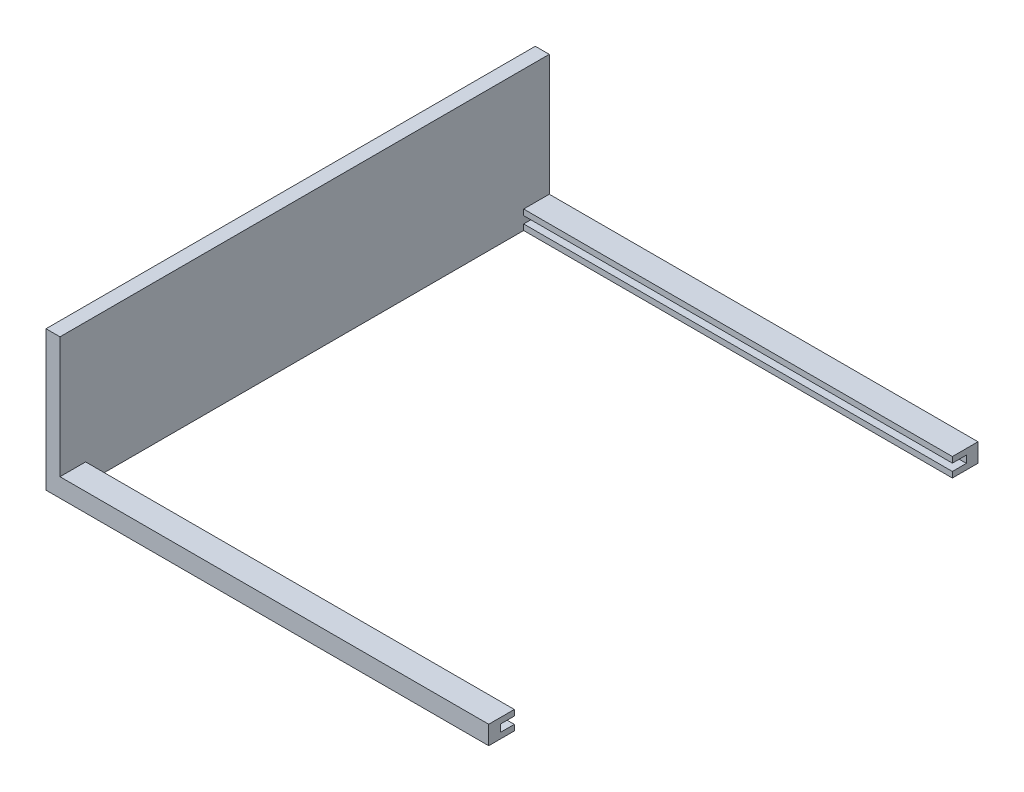
ISO-10303-21;
HEADER;
FILE_DESCRIPTION(('STEP AP214'),'2;1');
FILE_NAME('part.step','',(''),(''),'','','');
FILE_SCHEMA(('AUTOMOTIVE_DESIGN { 1 0 10303 214 1 1 1 1 }'));
ENDSEC;
DATA;
#1=APPLICATION_CONTEXT('core data for automotive mechanical design processes');
#2=APPLICATION_PROTOCOL_DEFINITION('international standard','automotive_design',2000,#1);
#3=PRODUCT_CONTEXT('',#1,'mechanical');
#4=PRODUCT('Part','Part','',(#3));
#5=PRODUCT_RELATED_PRODUCT_CATEGORY('part','',(#4));
#6=PRODUCT_DEFINITION_FORMATION('','',#4);
#7=PRODUCT_DEFINITION_CONTEXT('part definition',#1,'design');
#8=PRODUCT_DEFINITION('design','',#6,#7);
#9=PRODUCT_DEFINITION_SHAPE('','',#8);
#10=(LENGTH_UNIT() NAMED_UNIT(*) SI_UNIT(.MILLI.,.METRE.));
#11=(NAMED_UNIT(*) PLANE_ANGLE_UNIT() SI_UNIT($,.RADIAN.));
#12=(NAMED_UNIT(*) SI_UNIT($,.STERADIAN.) SOLID_ANGLE_UNIT());
#13=UNCERTAINTY_MEASURE_WITH_UNIT(LENGTH_MEASURE(1.E-05),#10,'distance_accuracy_value','');
#14=(GEOMETRIC_REPRESENTATION_CONTEXT(3) GLOBAL_UNCERTAINTY_ASSIGNED_CONTEXT((#13)) GLOBAL_UNIT_ASSIGNED_CONTEXT((#10,
#11,#12)) REPRESENTATION_CONTEXT('',''));
#15=CARTESIAN_POINT('',(0.,0.,0.));
#16=DIRECTION('',(0.,0.,1.));
#17=DIRECTION('',(1.,0.,0.));
#18=AXIS2_PLACEMENT_3D('',#15,#16,#17);
#19=CARTESIAN_POINT('',(92.,0.,-105.));
#20=DIRECTION('',(0.,1.,0.));
#21=DIRECTION('',(-1.,0.,0.));
#22=AXIS2_PLACEMENT_3D('',#19,#20,#21);
#23=PLANE('',#22);
#24=DIRECTION('',(0.,0.,1.));
#25=VECTOR('',#24,1.);
#26=CARTESIAN_POINT('',(92.,0.,-105.));
#27=LINE('',#26,#25);
#28=CARTESIAN_POINT('',(92.,0.,-5.50000000000001));
#29=VERTEX_POINT('',#28);
#30=CARTESIAN_POINT('',(92.,0.,0.));
#31=VERTEX_POINT('',#30);
#32=EDGE_CURVE('E130',#29,#31,#27,.T.);
#33=ORIENTED_EDGE('',*,*,#32,.F.);
#34=DIRECTION('',(-1.,0.,0.));
#35=VECTOR('',#34,1.);
#36=CARTESIAN_POINT('',(100.,0.,-5.50000000000001));
#37=LINE('',#36,#35);
#38=CARTESIAN_POINT('',(0.,0.,-5.50000000000001));
#39=VERTEX_POINT('',#38);
#40=EDGE_CURVE('E259',#29,#39,#37,.T.);
#41=ORIENTED_EDGE('',*,*,#40,.T.);
#42=DIRECTION('',(0.,0.,1.));
#43=VECTOR('',#42,1.);
#44=CARTESIAN_POINT('',(0.,0.,-105.));
#45=LINE('',#44,#43);
#46=CARTESIAN_POINT('',(0.,0.,0.));
#47=VERTEX_POINT('',#46);
#48=EDGE_CURVE('E129',#39,#47,#45,.T.);
#49=ORIENTED_EDGE('',*,*,#48,.T.);
#50=DIRECTION('',(-1.,0.,0.));
#51=VECTOR('',#50,1.);
#52=CARTESIAN_POINT('',(92.,0.,0.));
#53=LINE('',#52,#51);
#54=EDGE_CURVE('E173',#31,#47,#53,.T.);
#55=ORIENTED_EDGE('',*,*,#54,.F.);
#56=EDGE_LOOP('',(#33,#41,#49,#55));
#57=FACE_BOUND('',#56,.T.);
#58=ADVANCED_FACE('F45',(#57),#23,.T.);
#59=CARTESIAN_POINT('',(0.,0.,-105.));
#60=VERTEX_POINT('',#59);
#61=CARTESIAN_POINT('',(0.,0.,-99.5));
#62=VERTEX_POINT('',#61);
#63=EDGE_CURVE('E185',#60,#62,#45,.T.);
#64=ORIENTED_EDGE('',*,*,#63,.T.);
#65=DIRECTION('',(-1.,0.,0.));
#66=VECTOR('',#65,1.);
#67=CARTESIAN_POINT('',(100.,0.,-99.5));
#68=LINE('',#67,#66);
#69=CARTESIAN_POINT('',(92.,0.,-99.5));
#70=VERTEX_POINT('',#69);
#71=EDGE_CURVE('E124',#70,#62,#68,.T.);
#72=ORIENTED_EDGE('',*,*,#71,.F.);
#73=CARTESIAN_POINT('',(92.,0.,-105.));
#74=VERTEX_POINT('',#73);
#75=EDGE_CURVE('E116',#74,#70,#27,.T.);
#76=ORIENTED_EDGE('',*,*,#75,.F.);
#77=DIRECTION('',(-1.,0.,0.));
#78=VECTOR('',#77,1.);
#79=CARTESIAN_POINT('',(92.,0.,-105.));
#80=LINE('',#79,#78);
#81=EDGE_CURVE('E120',#74,#60,#80,.T.);
#82=ORIENTED_EDGE('',*,*,#81,.T.);
#83=EDGE_LOOP('',(#64,#72,#76,#82));
#84=FACE_BOUND('',#83,.T.);
#85=ADVANCED_FACE('F119',(#84),#23,.T.);
#86=CARTESIAN_POINT('',(92.,-4.00000000000001,-105.));
#87=DIRECTION('',(1.,0.,0.));
#88=DIRECTION('',(0.,0.,-1.));
#89=AXIS2_PLACEMENT_3D('',#86,#87,#88);
#90=PLANE('',#89);
#91=DIRECTION('',(0.,0.,-1.));
#92=VECTOR('',#91,1.);
#93=CARTESIAN_POINT('',(92.,-1.22999999999954,-105.));
#94=LINE('',#93,#92);
#95=CARTESIAN_POINT('',(92.,-1.23000000000001,-2.5));
#96=VERTEX_POINT('',#95);
#97=CARTESIAN_POINT('',(92.,-1.22999999999999,-5.50000000000001));
#98=VERTEX_POINT('',#97);
#99=EDGE_CURVE('E54',#96,#98,#94,.T.);
#100=ORIENTED_EDGE('',*,*,#99,.T.);
#101=DIRECTION('',(0.,1.,0.));
#102=VECTOR('',#101,1.);
#103=CARTESIAN_POINT('',(92.,-4.00000000000001,-5.50000000000001));
#104=LINE('',#103,#102);
#105=EDGE_CURVE('E11',#98,#29,#104,.T.);
#106=ORIENTED_EDGE('',*,*,#105,.T.);
#107=ORIENTED_EDGE('',*,*,#32,.T.);
#108=DIRECTION('',(0.,1.,0.));
#109=VECTOR('',#108,1.);
#110=CARTESIAN_POINT('',(92.,-4.00000000000001,0.));
#111=LINE('',#110,#109);
#112=CARTESIAN_POINT('',(92.,-4.00000000000001,0.));
#113=VERTEX_POINT('',#112);
#114=EDGE_CURVE('E169',#113,#31,#111,.T.);
#115=ORIENTED_EDGE('',*,*,#114,.F.);
#116=DIRECTION('',(0.,0.,1.));
#117=VECTOR('',#116,1.);
#118=CARTESIAN_POINT('',(92.,-4.00000000000001,-105.));
#119=LINE('',#118,#117);
#120=CARTESIAN_POINT('',(92.,-4.00000000000001,-5.5));
#121=VERTEX_POINT('',#120);
#122=EDGE_CURVE('E190',#121,#113,#119,.T.);
#123=ORIENTED_EDGE('',*,*,#122,.F.);
#124=DIRECTION('',(0.,1.,0.));
#125=VECTOR('',#124,1.);
#126=CARTESIAN_POINT('',(92.,-4.00000000000001,-5.50000000000001));
#127=LINE('',#126,#125);
#128=CARTESIAN_POINT('',(92.,-2.77000000000001,-5.5));
#129=VERTEX_POINT('',#128);
#130=EDGE_CURVE('E161',#121,#129,#127,.T.);
#131=ORIENTED_EDGE('',*,*,#130,.T.);
#132=DIRECTION('',(0.,0.,1.));
#133=VECTOR('',#132,1.);
#134=CARTESIAN_POINT('',(92.,-2.77000000000001,-105.));
#135=LINE('',#134,#133);
#136=CARTESIAN_POINT('',(92.,-2.77000000000001,-2.5));
#137=VERTEX_POINT('',#136);
#138=EDGE_CURVE('E217',#129,#137,#135,.T.);
#139=ORIENTED_EDGE('',*,*,#138,.T.);
#140=DIRECTION('',(0.,1.,0.));
#141=VECTOR('',#140,1.);
#142=CARTESIAN_POINT('',(92.,-4.00000000000001,-2.5));
#143=LINE('',#142,#141);
#144=EDGE_CURVE('E221',#137,#96,#143,.T.);
#145=ORIENTED_EDGE('',*,*,#144,.T.);
#146=EDGE_LOOP('',(#100,#106,#107,#115,#123,#131,#139,#145));
#147=FACE_BOUND('',#146,.T.);
#148=ADVANCED_FACE('F229',(#147),#90,.T.);
#149=DIRECTION('',(0.,0.,1.));
#150=VECTOR('',#149,1.);
#151=CARTESIAN_POINT('',(92.,-2.77000000000001,-105.));
#152=LINE('',#151,#150);
#153=CARTESIAN_POINT('',(92.,-2.77000000000001,-102.5));
#154=VERTEX_POINT('',#153);
#155=CARTESIAN_POINT('',(92.,-2.77000000000001,-99.5));
#156=VERTEX_POINT('',#155);
#157=EDGE_CURVE('E214',#154,#156,#152,.T.);
#158=ORIENTED_EDGE('',*,*,#157,.T.);
#159=DIRECTION('',(0.,-1.,0.));
#160=VECTOR('',#159,1.);
#161=CARTESIAN_POINT('',(92.,-4.00000000000001,-99.5));
#162=LINE('',#161,#160);
#163=CARTESIAN_POINT('',(92.,-4.,-99.5));
#164=VERTEX_POINT('',#163);
#165=EDGE_CURVE('E268',#156,#164,#162,.T.);
#166=ORIENTED_EDGE('',*,*,#165,.T.);
#167=CARTESIAN_POINT('',(92.,-4.00000000000001,-105.));
#168=VERTEX_POINT('',#167);
#169=EDGE_CURVE('E145',#168,#164,#119,.T.);
#170=ORIENTED_EDGE('',*,*,#169,.F.);
#171=DIRECTION('',(0.,1.,0.));
#172=VECTOR('',#171,1.);
#173=CARTESIAN_POINT('',(92.,-4.00000000000001,-105.));
#174=LINE('',#173,#172);
#175=EDGE_CURVE('E136',#168,#74,#174,.T.);
#176=ORIENTED_EDGE('',*,*,#175,.T.);
#177=ORIENTED_EDGE('',*,*,#75,.T.);
#178=DIRECTION('',(0.,-1.,0.));
#179=VECTOR('',#178,1.);
#180=CARTESIAN_POINT('',(92.,-4.00000000000001,-99.5));
#181=LINE('',#180,#179);
#182=CARTESIAN_POINT('',(92.,-1.22999999999999,-99.5));
#183=VERTEX_POINT('',#182);
#184=EDGE_CURVE('E203',#70,#183,#181,.T.);
#185=ORIENTED_EDGE('',*,*,#184,.T.);
#186=DIRECTION('',(0.,0.,-1.));
#187=VECTOR('',#186,1.);
#188=CARTESIAN_POINT('',(92.,-1.22999999999999,-105.));
#189=LINE('',#188,#187);
#190=CARTESIAN_POINT('',(92.,-1.22999999999999,-102.5));
#191=VERTEX_POINT('',#190);
#192=EDGE_CURVE('E206',#183,#191,#189,.T.);
#193=ORIENTED_EDGE('',*,*,#192,.T.);
#194=DIRECTION('',(0.,-1.,0.));
#195=VECTOR('',#194,1.);
#196=CARTESIAN_POINT('',(92.,-4.00000000000001,-102.5));
#197=LINE('',#196,#195);
#198=EDGE_CURVE('E210',#191,#154,#197,.T.);
#199=ORIENTED_EDGE('',*,*,#198,.T.);
#200=EDGE_LOOP('',(#158,#166,#170,#176,#177,#185,#193,#199));
#201=FACE_BOUND('',#200,.T.);
#202=ADVANCED_FACE('F142',(#201),#90,.T.);
#203=CARTESIAN_POINT('',(-2.99999999999999,-4.00000000000001,-105.));
#204=DIRECTION('',(0.,-1.,0.));
#205=DIRECTION('',(0.,0.,-1.));
#206=AXIS2_PLACEMENT_3D('',#203,#204,#205);
#207=PLANE('',#206);
#208=DIRECTION('',(0.,0.,-1.));
#209=VECTOR('',#208,1.);
#210=CARTESIAN_POINT('',(0.,-4.00000000000001,-5.5));
#211=LINE('',#210,#209);
#212=CARTESIAN_POINT('',(0.,-4.00000000000001,-5.50000000000001));
#213=VERTEX_POINT('',#212);
#214=CARTESIAN_POINT('',(0.,-4.,-99.5));
#215=VERTEX_POINT('',#214);
#216=EDGE_CURVE('E522',#213,#215,#211,.T.);
#217=ORIENTED_EDGE('',*,*,#216,.F.);
#218=DIRECTION('',(1.,0.,0.));
#219=VECTOR('',#218,1.);
#220=CARTESIAN_POINT('',(-2.99999999999999,-4.00000000000001,-5.50000000000001));
#221=LINE('',#220,#219);
#222=EDGE_CURVE('E199',#213,#121,#221,.T.);
#223=ORIENTED_EDGE('',*,*,#222,.T.);
#224=ORIENTED_EDGE('',*,*,#122,.T.);
#225=DIRECTION('',(1.,0.,0.));
#226=VECTOR('',#225,1.);
#227=CARTESIAN_POINT('',(-2.99999999999999,-4.00000000000001,0.));
#228=LINE('',#227,#226);
#229=CARTESIAN_POINT('',(-2.99999999999999,-4.00000000000001,0.));
#230=VERTEX_POINT('',#229);
#231=EDGE_CURVE('E165',#230,#113,#228,.T.);
#232=ORIENTED_EDGE('',*,*,#231,.F.);
#233=DIRECTION('',(0.,0.,1.));
#234=VECTOR('',#233,1.);
#235=CARTESIAN_POINT('',(-2.99999999999999,-4.00000000000001,-105.));
#236=LINE('',#235,#234);
#237=CARTESIAN_POINT('',(-2.99999999999999,-4.00000000000001,-105.));
#238=VERTEX_POINT('',#237);
#239=EDGE_CURVE('E191',#238,#230,#236,.T.);
#240=ORIENTED_EDGE('',*,*,#239,.F.);
#241=DIRECTION('',(1.,0.,0.));
#242=VECTOR('',#241,1.);
#243=CARTESIAN_POINT('',(-2.99999999999999,-4.00000000000001,-105.));
#244=LINE('',#243,#242);
#245=EDGE_CURVE('E147',#238,#168,#244,.T.);
#246=ORIENTED_EDGE('',*,*,#245,.T.);
#247=ORIENTED_EDGE('',*,*,#169,.T.);
#248=DIRECTION('',(-1.,0.,0.));
#249=VECTOR('',#248,1.);
#250=CARTESIAN_POINT('',(-2.99999999999999,-4.00000000000001,-99.5));
#251=LINE('',#250,#249);
#252=EDGE_CURVE('E184',#164,#215,#251,.T.);
#253=ORIENTED_EDGE('',*,*,#252,.T.);
#254=EDGE_LOOP('',(#217,#223,#224,#232,#240,#246,#247,#253));
#255=FACE_BOUND('',#254,.T.);
#256=ADVANCED_FACE('F297',(#255),#207,.T.);
#257=CARTESIAN_POINT('',(0.,26.,-105.));
#258=DIRECTION('',(0.,1.,0.));
#259=DIRECTION('',(0.,0.,1.));
#260=AXIS2_PLACEMENT_3D('',#257,#258,#259);
#261=PLANE('',#260);
#262=DIRECTION('',(-1.,0.,0.));
#263=VECTOR('',#262,1.);
#264=CARTESIAN_POINT('',(0.,26.,0.));
#265=LINE('',#264,#263);
#266=CARTESIAN_POINT('',(0.,26.,0.));
#267=VERTEX_POINT('',#266);
#268=CARTESIAN_POINT('',(-3.,26.,0.));
#269=VERTEX_POINT('',#268);
#270=EDGE_CURVE('E156',#267,#269,#265,.T.);
#271=ORIENTED_EDGE('',*,*,#270,.F.);
#272=DIRECTION('',(0.,0.,1.));
#273=VECTOR('',#272,1.);
#274=CARTESIAN_POINT('',(0.,26.,-105.));
#275=LINE('',#274,#273);
#276=CARTESIAN_POINT('',(0.,26.,-105.));
#277=VERTEX_POINT('',#276);
#278=EDGE_CURVE('E70',#277,#267,#275,.T.);
#279=ORIENTED_EDGE('',*,*,#278,.F.);
#280=DIRECTION('',(-1.,0.,0.));
#281=VECTOR('',#280,1.);
#282=CARTESIAN_POINT('',(0.,26.,-105.));
#283=LINE('',#282,#281);
#284=CARTESIAN_POINT('',(-3.,26.,-105.));
#285=VERTEX_POINT('',#284);
#286=EDGE_CURVE('E181',#277,#285,#283,.T.);
#287=ORIENTED_EDGE('',*,*,#286,.T.);
#288=DIRECTION('',(0.,0.,1.));
#289=VECTOR('',#288,1.);
#290=CARTESIAN_POINT('',(-3.,26.,-105.));
#291=LINE('',#290,#289);
#292=EDGE_CURVE('E102',#285,#269,#291,.T.);
#293=ORIENTED_EDGE('',*,*,#292,.T.);
#294=EDGE_LOOP('',(#271,#279,#287,#293));
#295=FACE_BOUND('',#294,.T.);
#296=ADVANCED_FACE('F47',(#295),#261,.T.);
#297=CARTESIAN_POINT('',(0.,26.,-105.));
#298=DIRECTION('',(1.,0.,0.));
#299=DIRECTION('',(0.,1.,0.));
#300=AXIS2_PLACEMENT_3D('',#297,#298,#299);
#301=PLANE('',#300);
#302=DIRECTION('',(0.,1.,0.));
#303=VECTOR('',#302,1.);
#304=CARTESIAN_POINT('',(0.,26.,0.));
#305=LINE('',#304,#303);
#306=EDGE_CURVE('E177',#47,#267,#305,.T.);
#307=ORIENTED_EDGE('',*,*,#306,.F.);
#308=ORIENTED_EDGE('',*,*,#48,.F.);
#309=DIRECTION('',(0.,-1.,0.));
#310=VECTOR('',#309,1.);
#311=CARTESIAN_POINT('',(0.,0.,-5.50000000000001));
#312=LINE('',#311,#310);
#313=CARTESIAN_POINT('',(0.,-1.22999999999999,-5.50000000000001));
#314=VERTEX_POINT('',#313);
#315=EDGE_CURVE('E287',#39,#314,#312,.T.);
#316=ORIENTED_EDGE('',*,*,#315,.T.);
#317=DIRECTION('',(0.,0.,1.));
#318=VECTOR('',#317,1.);
#319=CARTESIAN_POINT('',(0.,-1.22999999999999,-5.50000000000001));
#320=LINE('',#319,#318);
#321=CARTESIAN_POINT('',(0.,-1.23000000000001,-2.5));
#322=VERTEX_POINT('',#321);
#323=EDGE_CURVE('E571',#314,#322,#320,.T.);
#324=ORIENTED_EDGE('',*,*,#323,.T.);
#325=DIRECTION('',(0.,-1.,0.));
#326=VECTOR('',#325,1.);
#327=CARTESIAN_POINT('',(0.,-1.23000000000001,-2.5));
#328=LINE('',#327,#326);
#329=CARTESIAN_POINT('',(0.,-2.77000000000001,-2.5));
#330=VERTEX_POINT('',#329);
#331=EDGE_CURVE('E253',#322,#330,#328,.T.);
#332=ORIENTED_EDGE('',*,*,#331,.T.);
#333=DIRECTION('',(0.,0.,-1.));
#334=VECTOR('',#333,1.);
#335=CARTESIAN_POINT('',(0.,-2.77000000000001,-2.5));
#336=LINE('',#335,#334);
#337=CARTESIAN_POINT('',(0.,-2.77000000000001,-5.5));
#338=VERTEX_POINT('',#337);
#339=EDGE_CURVE('E514',#330,#338,#336,.T.);
#340=ORIENTED_EDGE('',*,*,#339,.T.);
#341=DIRECTION('',(0.,-1.,0.));
#342=VECTOR('',#341,1.);
#343=CARTESIAN_POINT('',(0.,-2.77000000000001,-5.5));
#344=LINE('',#343,#342);
#345=EDGE_CURVE('E61',#338,#213,#344,.T.);
#346=ORIENTED_EDGE('',*,*,#345,.T.);
#347=ORIENTED_EDGE('',*,*,#216,.T.);
#348=DIRECTION('',(0.,1.,0.));
#349=VECTOR('',#348,1.);
#350=CARTESIAN_POINT('',(0.,-4.,-99.5));
#351=LINE('',#350,#349);
#352=CARTESIAN_POINT('',(0.,-2.77000000000001,-99.5));
#353=VERTEX_POINT('',#352);
#354=EDGE_CURVE('E525',#215,#353,#351,.T.);
#355=ORIENTED_EDGE('',*,*,#354,.T.);
#356=DIRECTION('',(0.,0.,-1.));
#357=VECTOR('',#356,1.);
#358=CARTESIAN_POINT('',(0.,-2.77000000000001,-102.5));
#359=LINE('',#358,#357);
#360=CARTESIAN_POINT('',(0.,-2.77000000000001,-102.5));
#361=VERTEX_POINT('',#360);
#362=EDGE_CURVE('E532',#353,#361,#359,.T.);
#363=ORIENTED_EDGE('',*,*,#362,.T.);
#364=DIRECTION('',(0.,1.,0.));
#365=VECTOR('',#364,1.);
#366=CARTESIAN_POINT('',(0.,-1.22999999999999,-102.5));
#367=LINE('',#366,#365);
#368=CARTESIAN_POINT('',(0.,-1.22999999999999,-102.5));
#369=VERTEX_POINT('',#368);
#370=EDGE_CURVE('E489',#361,#369,#367,.T.);
#371=ORIENTED_EDGE('',*,*,#370,.T.);
#372=DIRECTION('',(0.,0.,1.));
#373=VECTOR('',#372,1.);
#374=CARTESIAN_POINT('',(0.,-1.22999999999999,-99.5));
#375=LINE('',#374,#373);
#376=CARTESIAN_POINT('',(0.,-1.22999999999999,-99.5));
#377=VERTEX_POINT('',#376);
#378=EDGE_CURVE('E485',#369,#377,#375,.T.);
#379=ORIENTED_EDGE('',*,*,#378,.T.);
#380=DIRECTION('',(0.,1.,0.));
#381=VECTOR('',#380,1.);
#382=CARTESIAN_POINT('',(0.,-1.22999999999999,-99.5));
#383=LINE('',#382,#381);
#384=EDGE_CURVE('E476',#377,#62,#383,.T.);
#385=ORIENTED_EDGE('',*,*,#384,.T.);
#386=ORIENTED_EDGE('',*,*,#63,.F.);
#387=DIRECTION('',(0.,1.,0.));
#388=VECTOR('',#387,1.);
#389=CARTESIAN_POINT('',(0.,26.,-105.));
#390=LINE('',#389,#388);
#391=EDGE_CURVE('E138',#60,#277,#390,.T.);
#392=ORIENTED_EDGE('',*,*,#391,.T.);
#393=ORIENTED_EDGE('',*,*,#278,.T.);
#394=EDGE_LOOP('',(#307,#308,#316,#324,#332,#340,#346,#347,#355,#363,#371,#379,#385,#386,#392,#393));
#395=FACE_BOUND('',#394,.T.);
#396=ADVANCED_FACE('F282',(#395),#301,.T.);
#397=CARTESIAN_POINT('',(-3.,26.,-105.));
#398=DIRECTION('',(-1.,0.,0.));
#399=DIRECTION('',(0.,-1.,0.));
#400=AXIS2_PLACEMENT_3D('',#397,#398,#399);
#401=PLANE('',#400);
#402=DIRECTION('',(0.,-1.,0.));
#403=VECTOR('',#402,1.);
#404=CARTESIAN_POINT('',(-3.,26.,0.));
#405=LINE('',#404,#403);
#406=EDGE_CURVE('E160',#269,#230,#405,.T.);
#407=ORIENTED_EDGE('',*,*,#406,.F.);
#408=ORIENTED_EDGE('',*,*,#292,.F.);
#409=DIRECTION('',(0.,-1.,0.));
#410=VECTOR('',#409,1.);
#411=CARTESIAN_POINT('',(-3.,26.,-105.));
#412=LINE('',#411,#410);
#413=EDGE_CURVE('E150',#285,#238,#412,.T.);
#414=ORIENTED_EDGE('',*,*,#413,.T.);
#415=ORIENTED_EDGE('',*,*,#239,.T.);
#416=EDGE_LOOP('',(#407,#408,#414,#415));
#417=FACE_BOUND('',#416,.T.);
#418=ADVANCED_FACE('F276',(#417),#401,.T.);
#419=CARTESIAN_POINT('',(0.,0.,-105.));
#420=DIRECTION('',(0.,0.,1.));
#421=DIRECTION('',(1.,0.,0.));
#422=AXIS2_PLACEMENT_3D('',#419,#420,#421);
#423=PLANE('',#422);
#424=ORIENTED_EDGE('',*,*,#286,.F.);
#425=ORIENTED_EDGE('',*,*,#391,.F.);
#426=ORIENTED_EDGE('',*,*,#81,.F.);
#427=ORIENTED_EDGE('',*,*,#175,.F.);
#428=ORIENTED_EDGE('',*,*,#245,.F.);
#429=ORIENTED_EDGE('',*,*,#413,.F.);
#430=EDGE_LOOP('',(#424,#425,#426,#427,#428,#429));
#431=FACE_BOUND('',#430,.T.);
#432=ADVANCED_FACE('F134',(#431),#423,.F.);
#433=CARTESIAN_POINT('',(0.,0.,0.));
#434=DIRECTION('',(0.,0.,1.));
#435=DIRECTION('',(1.,0.,0.));
#436=AXIS2_PLACEMENT_3D('',#433,#434,#435);
#437=PLANE('',#436);
#438=ORIENTED_EDGE('',*,*,#270,.T.);
#439=ORIENTED_EDGE('',*,*,#406,.T.);
#440=ORIENTED_EDGE('',*,*,#231,.T.);
#441=ORIENTED_EDGE('',*,*,#114,.T.);
#442=ORIENTED_EDGE('',*,*,#54,.T.);
#443=ORIENTED_EDGE('',*,*,#306,.T.);
#444=EDGE_LOOP('',(#438,#439,#440,#441,#442,#443));
#445=FACE_BOUND('',#444,.T.);
#446=ADVANCED_FACE('F279',(#445),#437,.T.);
#447=CARTESIAN_POINT('',(100.,0.,-5.50000000000001));
#448=DIRECTION('',(0.,0.,-1.));
#449=DIRECTION('',(-1.,0.,0.));
#450=AXIS2_PLACEMENT_3D('',#447,#448,#449);
#451=PLANE('',#450);
#452=DIRECTION('',(-1.,0.,0.));
#453=VECTOR('',#452,1.);
#454=CARTESIAN_POINT('',(100.,-1.22999999999999,-5.50000000000001));
#455=LINE('',#454,#453);
#456=EDGE_CURVE('E244',#98,#314,#455,.T.);
#457=ORIENTED_EDGE('',*,*,#456,.T.);
#458=ORIENTED_EDGE('',*,*,#315,.F.);
#459=ORIENTED_EDGE('',*,*,#40,.F.);
#460=ORIENTED_EDGE('',*,*,#105,.F.);
#461=EDGE_LOOP('',(#457,#458,#459,#460));
#462=FACE_BOUND('',#461,.T.);
#463=ADVANCED_FACE('F351',(#462),#451,.T.);
#464=CARTESIAN_POINT('',(100.,-1.22999999999999,-5.50000000000001));
#465=DIRECTION('',(0.,-1.,0.));
#466=DIRECTION('',(0.,0.,-1.));
#467=AXIS2_PLACEMENT_3D('',#464,#465,#466);
#468=PLANE('',#467);
#469=DIRECTION('',(-1.,0.,0.));
#470=VECTOR('',#469,1.);
#471=CARTESIAN_POINT('',(100.,-1.23000000000001,-2.5));
#472=LINE('',#471,#470);
#473=EDGE_CURVE('E241',#96,#322,#472,.T.);
#474=ORIENTED_EDGE('',*,*,#473,.T.);
#475=ORIENTED_EDGE('',*,*,#323,.F.);
#476=ORIENTED_EDGE('',*,*,#456,.F.);
#477=ORIENTED_EDGE('',*,*,#99,.F.);
#478=EDGE_LOOP('',(#474,#475,#476,#477));
#479=FACE_BOUND('',#478,.T.);
#480=ADVANCED_FACE('F238',(#479),#468,.T.);
#481=CARTESIAN_POINT('',(100.,-1.23000000000001,-2.5));
#482=DIRECTION('',(0.,0.,-1.));
#483=DIRECTION('',(-1.,0.,0.));
#484=AXIS2_PLACEMENT_3D('',#481,#482,#483);
#485=PLANE('',#484);
#486=DIRECTION('',(-1.,0.,0.));
#487=VECTOR('',#486,1.);
#488=CARTESIAN_POINT('',(100.,-2.77000000000001,-2.5));
#489=LINE('',#488,#487);
#490=EDGE_CURVE('E255',#137,#330,#489,.T.);
#491=ORIENTED_EDGE('',*,*,#490,.T.);
#492=ORIENTED_EDGE('',*,*,#331,.F.);
#493=ORIENTED_EDGE('',*,*,#473,.F.);
#494=ORIENTED_EDGE('',*,*,#144,.F.);
#495=EDGE_LOOP('',(#491,#492,#493,#494));
#496=FACE_BOUND('',#495,.T.);
#497=ADVANCED_FACE('F250',(#496),#485,.T.);
#498=CARTESIAN_POINT('',(100.,-2.77000000000001,-2.5));
#499=DIRECTION('',(0.,1.,0.));
#500=DIRECTION('',(0.,0.,1.));
#501=AXIS2_PLACEMENT_3D('',#498,#499,#500);
#502=PLANE('',#501);
#503=DIRECTION('',(-1.,0.,0.));
#504=VECTOR('',#503,1.);
#505=CARTESIAN_POINT('',(100.,-2.77000000000001,-5.5));
#506=LINE('',#505,#504);
#507=EDGE_CURVE('E261',#129,#338,#506,.T.);
#508=ORIENTED_EDGE('',*,*,#507,.T.);
#509=ORIENTED_EDGE('',*,*,#339,.F.);
#510=ORIENTED_EDGE('',*,*,#490,.F.);
#511=ORIENTED_EDGE('',*,*,#138,.F.);
#512=EDGE_LOOP('',(#508,#509,#510,#511));
#513=FACE_BOUND('',#512,.T.);
#514=ADVANCED_FACE('F395',(#513),#502,.T.);
#515=CARTESIAN_POINT('',(100.,-2.77000000000001,-5.5));
#516=DIRECTION('',(0.,0.,-1.));
#517=DIRECTION('',(-1.,0.,0.));
#518=AXIS2_PLACEMENT_3D('',#515,#516,#517);
#519=PLANE('',#518);
#520=ORIENTED_EDGE('',*,*,#222,.F.);
#521=ORIENTED_EDGE('',*,*,#345,.F.);
#522=ORIENTED_EDGE('',*,*,#507,.F.);
#523=ORIENTED_EDGE('',*,*,#130,.F.);
#524=EDGE_LOOP('',(#520,#521,#522,#523));
#525=FACE_BOUND('',#524,.T.);
#526=ADVANCED_FACE('F403',(#525),#519,.T.);
#527=CARTESIAN_POINT('',(100.,-4.,-99.5));
#528=DIRECTION('',(0.,0.,1.));
#529=DIRECTION('',(1.,0.,0.));
#530=AXIS2_PLACEMENT_3D('',#527,#528,#529);
#531=PLANE('',#530);
#532=DIRECTION('',(-1.,0.,0.));
#533=VECTOR('',#532,1.);
#534=CARTESIAN_POINT('',(100.,-2.77000000000001,-99.5));
#535=LINE('',#534,#533);
#536=EDGE_CURVE('E504',#156,#353,#535,.T.);
#537=ORIENTED_EDGE('',*,*,#536,.T.);
#538=ORIENTED_EDGE('',*,*,#354,.F.);
#539=ORIENTED_EDGE('',*,*,#252,.F.);
#540=ORIENTED_EDGE('',*,*,#165,.F.);
#541=EDGE_LOOP('',(#537,#538,#539,#540));
#542=FACE_BOUND('',#541,.T.);
#543=ADVANCED_FACE('F412',(#542),#531,.T.);
#544=CARTESIAN_POINT('',(100.,-2.77000000000001,-102.5));
#545=DIRECTION('',(0.,1.,0.));
#546=DIRECTION('',(0.,0.,1.));
#547=AXIS2_PLACEMENT_3D('',#544,#545,#546);
#548=PLANE('',#547);
#549=DIRECTION('',(-1.,0.,0.));
#550=VECTOR('',#549,1.);
#551=CARTESIAN_POINT('',(100.,-2.77000000000001,-102.5));
#552=LINE('',#551,#550);
#553=EDGE_CURVE('E500',#154,#361,#552,.T.);
#554=ORIENTED_EDGE('',*,*,#553,.T.);
#555=ORIENTED_EDGE('',*,*,#362,.F.);
#556=ORIENTED_EDGE('',*,*,#536,.F.);
#557=ORIENTED_EDGE('',*,*,#157,.F.);
#558=EDGE_LOOP('',(#554,#555,#556,#557));
#559=FACE_BOUND('',#558,.T.);
#560=ADVANCED_FACE('F421',(#559),#548,.T.);
#561=CARTESIAN_POINT('',(100.,-1.22999999999999,-102.5));
#562=DIRECTION('',(0.,0.,1.));
#563=DIRECTION('',(1.,0.,0.));
#564=AXIS2_PLACEMENT_3D('',#561,#562,#563);
#565=PLANE('',#564);
#566=DIRECTION('',(-1.,0.,0.));
#567=VECTOR('',#566,1.);
#568=CARTESIAN_POINT('',(100.,-1.22999999999999,-102.5));
#569=LINE('',#568,#567);
#570=EDGE_CURVE('E496',#191,#369,#569,.T.);
#571=ORIENTED_EDGE('',*,*,#570,.T.);
#572=ORIENTED_EDGE('',*,*,#370,.F.);
#573=ORIENTED_EDGE('',*,*,#553,.F.);
#574=ORIENTED_EDGE('',*,*,#198,.F.);
#575=EDGE_LOOP('',(#571,#572,#573,#574));
#576=FACE_BOUND('',#575,.T.);
#577=ADVANCED_FACE('F430',(#576),#565,.T.);
#578=CARTESIAN_POINT('',(100.,-1.22999999999999,-99.5));
#579=DIRECTION('',(0.,-1.,0.));
#580=DIRECTION('',(0.,0.,-1.));
#581=AXIS2_PLACEMENT_3D('',#578,#579,#580);
#582=PLANE('',#581);
#583=DIRECTION('',(-1.,0.,0.));
#584=VECTOR('',#583,1.);
#585=CARTESIAN_POINT('',(100.,-1.22999999999999,-99.5));
#586=LINE('',#585,#584);
#587=EDGE_CURVE('E480',#183,#377,#586,.T.);
#588=ORIENTED_EDGE('',*,*,#587,.T.);
#589=ORIENTED_EDGE('',*,*,#378,.F.);
#590=ORIENTED_EDGE('',*,*,#570,.F.);
#591=ORIENTED_EDGE('',*,*,#192,.F.);
#592=EDGE_LOOP('',(#588,#589,#590,#591));
#593=FACE_BOUND('',#592,.T.);
#594=ADVANCED_FACE('F439',(#593),#582,.T.);
#595=CARTESIAN_POINT('',(100.,-1.22999999999999,-99.5));
#596=DIRECTION('',(0.,0.,1.));
#597=DIRECTION('',(1.,0.,0.));
#598=AXIS2_PLACEMENT_3D('',#595,#596,#597);
#599=PLANE('',#598);
#600=ORIENTED_EDGE('',*,*,#71,.T.);
#601=ORIENTED_EDGE('',*,*,#384,.F.);
#602=ORIENTED_EDGE('',*,*,#587,.F.);
#603=ORIENTED_EDGE('',*,*,#184,.F.);
#604=EDGE_LOOP('',(#600,#601,#602,#603));
#605=FACE_BOUND('',#604,.T.);
#606=ADVANCED_FACE('F448',(#605),#599,.T.);
#607=CLOSED_SHELL('',(#58,#85,#148,#202,#256,#296,#396,#418,#432,#446,#463,#480,#497,#514,#526,
#543,#560,#577,#594,#606));
#608=MANIFOLD_SOLID_BREP('B2',#607);
#609=ADVANCED_BREP_SHAPE_REPRESENTATION('',(#18,#608),#14);
#610=SHAPE_DEFINITION_REPRESENTATION(#9,#609);
ENDSEC;
END-ISO-10303-21;
